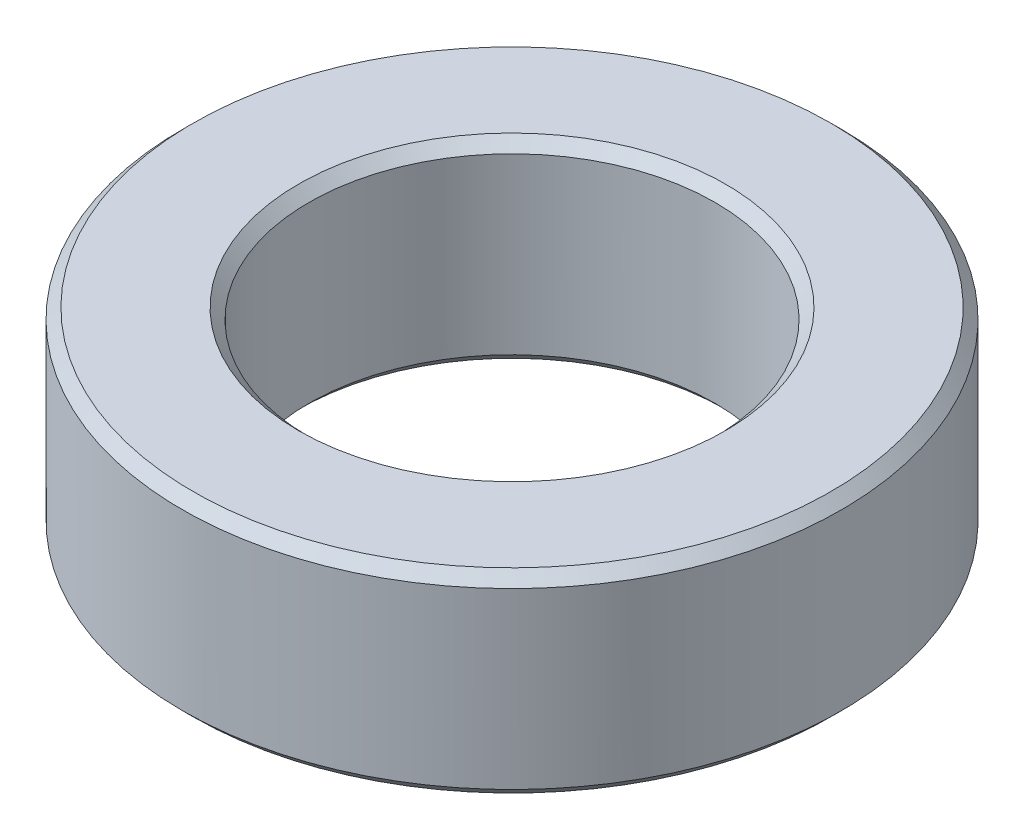
ISO-10303-21;
HEADER;
FILE_DESCRIPTION(('STEP AP214'),'2;1');
FILE_NAME('part.step','',(''),(''),'','','');
FILE_SCHEMA(('AUTOMOTIVE_DESIGN { 1 0 10303 214 1 1 1 1 }'));
ENDSEC;
DATA;
#1=APPLICATION_CONTEXT('core data for automotive mechanical design processes');
#2=APPLICATION_PROTOCOL_DEFINITION('international standard','automotive_design',2000,#1);
#3=PRODUCT_CONTEXT('',#1,'mechanical');
#4=PRODUCT('Part','Part','',(#3));
#5=PRODUCT_RELATED_PRODUCT_CATEGORY('part','',(#4));
#6=PRODUCT_DEFINITION_FORMATION('','',#4);
#7=PRODUCT_DEFINITION_CONTEXT('part definition',#1,'design');
#8=PRODUCT_DEFINITION('design','',#6,#7);
#9=PRODUCT_DEFINITION_SHAPE('','',#8);
#10=(LENGTH_UNIT() NAMED_UNIT(*) SI_UNIT(.MILLI.,.METRE.));
#11=(NAMED_UNIT(*) PLANE_ANGLE_UNIT() SI_UNIT($,.RADIAN.));
#12=(NAMED_UNIT(*) SI_UNIT($,.STERADIAN.) SOLID_ANGLE_UNIT());
#13=UNCERTAINTY_MEASURE_WITH_UNIT(LENGTH_MEASURE(1.E-05),#10,'distance_accuracy_value','');
#14=(GEOMETRIC_REPRESENTATION_CONTEXT(3) GLOBAL_UNCERTAINTY_ASSIGNED_CONTEXT((#13)) GLOBAL_UNIT_ASSIGNED_CONTEXT((#10,
#11,#12)) REPRESENTATION_CONTEXT('',''));
#15=CARTESIAN_POINT('',(0.,0.,0.));
#16=DIRECTION('',(0.,0.,1.));
#17=DIRECTION('',(1.,0.,0.));
#18=AXIS2_PLACEMENT_3D('',#15,#16,#17);
#19=CARTESIAN_POINT('',(0.,4.699,0.));
#20=DIRECTION('',(0.,-1.,0.));
#21=DIRECTION('',(0.,0.,-1.));
#22=AXIS2_PLACEMENT_3D('',#19,#20,#21);
#23=CYLINDRICAL_SURFACE('',#22,4.8895);
#24=CARTESIAN_POINT('',(0.,0.253999999983989,0.));
#25=DIRECTION('',(0.,-1.,0.));
#26=DIRECTION('',(0.,0.,-1.));
#27=AXIS2_PLACEMENT_3D('',#24,#25,#26);
#28=CIRCLE('',#27,4.88950000004706);
#29=CARTESIAN_POINT('',(0.,0.253999999983989,-4.88950000004706));
#30=VERTEX_POINT('',#29);
#31=EDGE_CURVE('E30',#30,#30,#28,.T.);
#32=ORIENTED_EDGE('',*,*,#31,.T.);
#33=EDGE_LOOP('',(#32));
#34=FACE_BOUND('',#33,.T.);
#35=CARTESIAN_POINT('',(0.,4.44500000003245,0.));
#36=DIRECTION('',(0.,1.,0.));
#37=DIRECTION('',(0.,0.,1.));
#38=AXIS2_PLACEMENT_3D('',#35,#36,#37);
#39=CIRCLE('',#38,4.88949999999022);
#40=CARTESIAN_POINT('',(0.,4.44500000003245,4.88949999999022));
#41=VERTEX_POINT('',#40);
#42=EDGE_CURVE('E33',#41,#41,#39,.T.);
#43=ORIENTED_EDGE('',*,*,#42,.T.);
#44=EDGE_LOOP('',(#43));
#45=FACE_BOUND('',#44,.T.);
#46=ADVANCED_FACE('F15',(#34,#45),#23,.F.);
#47=CARTESIAN_POINT('',(0.,4.69900000001644,0.));
#48=DIRECTION('',(0.,1.,0.));
#49=DIRECTION('',(0.,0.,1.));
#50=AXIS2_PLACEMENT_3D('',#47,#48,#49);
#51=CONICAL_SURFACE('',#50,5.14350000003105,0.785398163509345);
#52=ORIENTED_EDGE('',*,*,#42,.F.);
#53=EDGE_LOOP('',(#52));
#54=FACE_BOUND('',#53,.T.);
#55=CARTESIAN_POINT('',(0.,4.69900000001644,0.));
#56=DIRECTION('',(0.,1.,0.));
#57=DIRECTION('',(0.,0.,1.));
#58=AXIS2_PLACEMENT_3D('',#55,#56,#57);
#59=CIRCLE('',#58,5.14350000003105);
#60=CARTESIAN_POINT('',(0.,4.69900000001644,5.14350000003105));
#61=VERTEX_POINT('',#60);
#62=EDGE_CURVE('E18',#61,#61,#59,.F.);
#63=ORIENTED_EDGE('',*,*,#62,.F.);
#64=EDGE_LOOP('',(#63));
#65=FACE_BOUND('',#64,.T.);
#66=ADVANCED_FACE('F50',(#54,#65),#51,.F.);
#67=CARTESIAN_POINT('',(0.,5.6843418860808E-11,0.));
#68=DIRECTION('',(0.,-1.,0.));
#69=DIRECTION('',(0.,0.,-1.));
#70=AXIS2_PLACEMENT_3D('',#67,#68,#69);
#71=CONICAL_SURFACE('',#70,5.14349999991737,0.785398163397448);
#72=CARTESIAN_POINT('',(0.,0.,0.));
#73=DIRECTION('',(0.,-1.,0.));
#74=DIRECTION('',(0.,0.,-1.));
#75=AXIS2_PLACEMENT_3D('',#72,#73,#74);
#76=CIRCLE('',#75,5.14349999997421);
#77=CARTESIAN_POINT('',(0.,0.,-5.14349999997421));
#78=VERTEX_POINT('',#77);
#79=EDGE_CURVE('E40',#78,#78,#76,.T.);
#80=ORIENTED_EDGE('',*,*,#79,.T.);
#81=EDGE_LOOP('',(#80));
#82=FACE_BOUND('',#81,.T.);
#83=ORIENTED_EDGE('',*,*,#31,.F.);
#84=EDGE_LOOP('',(#83));
#85=FACE_BOUND('',#84,.T.);
#86=ADVANCED_FACE('F52',(#82,#85),#71,.F.);
#87=CARTESIAN_POINT('',(0.,4.699,0.));
#88=DIRECTION('',(0.,1.,0.));
#89=DIRECTION('',(0.,0.,1.));
#90=AXIS2_PLACEMENT_3D('',#87,#88,#89);
#91=PLANE('',#90);
#92=ORIENTED_EDGE('',*,*,#62,.T.);
#93=EDGE_LOOP('',(#92));
#94=FACE_BOUND('',#93,.T.);
#95=CARTESIAN_POINT('',(0.,4.699,0.));
#96=DIRECTION('',(0.,-1.,0.));
#97=DIRECTION('',(0.,0.,-1.));
#98=AXIS2_PLACEMENT_3D('',#95,#96,#97);
#99=CIRCLE('',#98,7.6835);
#100=CARTESIAN_POINT('',(0.,4.699,-7.6835));
#101=VERTEX_POINT('',#100);
#102=EDGE_CURVE('E38',#101,#101,#99,.T.);
#103=ORIENTED_EDGE('',*,*,#102,.F.);
#104=EDGE_LOOP('',(#103));
#105=FACE_BOUND('',#104,.T.);
#106=ADVANCED_FACE('F47',(#94,#105),#91,.T.);
#107=CARTESIAN_POINT('',(0.,0.,0.));
#108=DIRECTION('',(0.,1.,0.));
#109=DIRECTION('',(0.,0.,1.));
#110=AXIS2_PLACEMENT_3D('',#107,#108,#109);
#111=PLANE('',#110);
#112=ORIENTED_EDGE('',*,*,#79,.F.);
#113=EDGE_LOOP('',(#112));
#114=FACE_BOUND('',#113,.T.);
#115=CARTESIAN_POINT('',(0.,0.,0.));
#116=DIRECTION('',(0.,1.,0.));
#117=DIRECTION('',(0.,0.,1.));
#118=AXIS2_PLACEMENT_3D('',#115,#116,#117);
#119=CIRCLE('',#118,7.6835);
#120=CARTESIAN_POINT('',(0.,0.,7.6835));
#121=VERTEX_POINT('',#120);
#122=EDGE_CURVE('E27',#121,#121,#119,.T.);
#123=ORIENTED_EDGE('',*,*,#122,.F.);
#124=EDGE_LOOP('',(#123));
#125=FACE_BOUND('',#124,.T.);
#126=ADVANCED_FACE('F76',(#114,#125),#111,.F.);
#127=CARTESIAN_POINT('',(0.,4.445,0.));
#128=DIRECTION('',(0.,-1.,0.));
#129=DIRECTION('',(0.,0.,-1.));
#130=AXIS2_PLACEMENT_3D('',#127,#128,#129);
#131=CONICAL_SURFACE('',#130,7.9375,0.785398163397452);
#132=CARTESIAN_POINT('',(0.,4.445,0.));
#133=DIRECTION('',(0.,-1.,0.));
#134=DIRECTION('',(0.,0.,-1.));
#135=AXIS2_PLACEMENT_3D('',#132,#133,#134);
#136=CIRCLE('',#135,7.9375);
#137=CARTESIAN_POINT('',(0.,4.445,-7.9375));
#138=VERTEX_POINT('',#137);
#139=EDGE_CURVE('E22',#138,#138,#136,.T.);
#140=ORIENTED_EDGE('',*,*,#139,.F.);
#141=EDGE_LOOP('',(#140));
#142=FACE_BOUND('',#141,.T.);
#143=ORIENTED_EDGE('',*,*,#102,.T.);
#144=EDGE_LOOP('',(#143));
#145=FACE_BOUND('',#144,.T.);
#146=ADVANCED_FACE('F69',(#142,#145),#131,.T.);
#147=CARTESIAN_POINT('',(0.,0.254000000000004,0.));
#148=DIRECTION('',(0.,1.,0.));
#149=DIRECTION('',(0.,0.,1.));
#150=AXIS2_PLACEMENT_3D('',#147,#148,#149);
#151=CONICAL_SURFACE('',#150,7.9375,0.785398163397442);
#152=CARTESIAN_POINT('',(0.,0.254000000000004,0.));
#153=DIRECTION('',(0.,-1.,0.));
#154=DIRECTION('',(0.,0.,-1.));
#155=AXIS2_PLACEMENT_3D('',#152,#153,#154);
#156=CIRCLE('',#155,7.9375);
#157=CARTESIAN_POINT('',(0.,0.254000000000004,-7.9375));
#158=VERTEX_POINT('',#157);
#159=EDGE_CURVE('E10',#158,#158,#156,.F.);
#160=ORIENTED_EDGE('',*,*,#159,.F.);
#161=EDGE_LOOP('',(#160));
#162=FACE_BOUND('',#161,.T.);
#163=ORIENTED_EDGE('',*,*,#122,.T.);
#164=EDGE_LOOP('',(#163));
#165=FACE_BOUND('',#164,.T.);
#166=ADVANCED_FACE('F64',(#162,#165),#151,.T.);
#167=CARTESIAN_POINT('',(0.,4.699,0.));
#168=DIRECTION('',(0.,-1.,0.));
#169=DIRECTION('',(0.,0.,-1.));
#170=AXIS2_PLACEMENT_3D('',#167,#168,#169);
#171=CYLINDRICAL_SURFACE('',#170,7.9375);
#172=ORIENTED_EDGE('',*,*,#159,.T.);
#173=EDGE_LOOP('',(#172));
#174=FACE_BOUND('',#173,.T.);
#175=ORIENTED_EDGE('',*,*,#139,.T.);
#176=EDGE_LOOP('',(#175));
#177=FACE_BOUND('',#176,.T.);
#178=ADVANCED_FACE('F62',(#174,#177),#171,.T.);
#179=CLOSED_SHELL('',(#46,#66,#86,#106,#126,#146,#166,#178));
#180=MANIFOLD_SOLID_BREP('B1',#179);
#181=ADVANCED_BREP_SHAPE_REPRESENTATION('',(#18,#180),#14);
#182=SHAPE_DEFINITION_REPRESENTATION(#9,#181);
ENDSEC;
END-ISO-10303-21;
